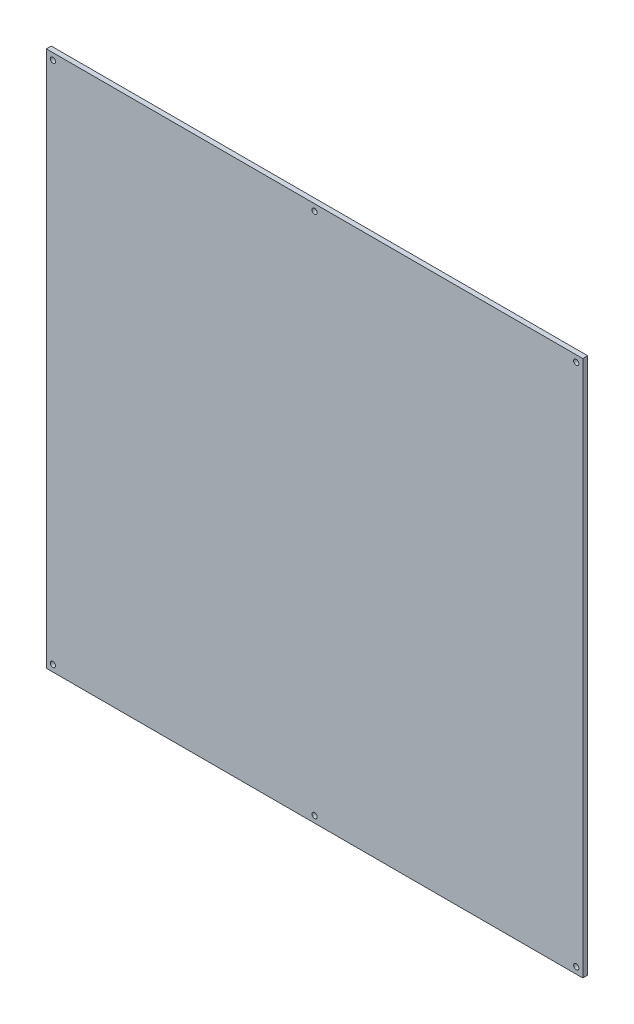
ISO-10303-21;
HEADER;
FILE_DESCRIPTION(('STEP AP214'),'2;1');
FILE_NAME('part.step','',(''),(''),'','','');
FILE_SCHEMA(('AUTOMOTIVE_DESIGN { 1 0 10303 214 1 1 1 1 }'));
ENDSEC;
DATA;
#1=APPLICATION_CONTEXT('core data for automotive mechanical design processes');
#2=APPLICATION_PROTOCOL_DEFINITION('international standard','automotive_design',2000,#1);
#3=PRODUCT_CONTEXT('',#1,'mechanical');
#4=PRODUCT('Part','Part','',(#3));
#5=PRODUCT_RELATED_PRODUCT_CATEGORY('part','',(#4));
#6=PRODUCT_DEFINITION_FORMATION('','',#4);
#7=PRODUCT_DEFINITION_CONTEXT('part definition',#1,'design');
#8=PRODUCT_DEFINITION('design','',#6,#7);
#9=PRODUCT_DEFINITION_SHAPE('','',#8);
#10=(LENGTH_UNIT() NAMED_UNIT(*) SI_UNIT(.MILLI.,.METRE.));
#11=(NAMED_UNIT(*) PLANE_ANGLE_UNIT() SI_UNIT($,.RADIAN.));
#12=(NAMED_UNIT(*) SI_UNIT($,.STERADIAN.) SOLID_ANGLE_UNIT());
#13=UNCERTAINTY_MEASURE_WITH_UNIT(LENGTH_MEASURE(1.E-05),#10,'distance_accuracy_value','');
#14=(GEOMETRIC_REPRESENTATION_CONTEXT(3) GLOBAL_UNCERTAINTY_ASSIGNED_CONTEXT((#13)) GLOBAL_UNIT_ASSIGNED_CONTEXT((#10,
#11,#12)) REPRESENTATION_CONTEXT('',''));
#15=CARTESIAN_POINT('',(0.,0.,0.));
#16=DIRECTION('',(0.,0.,1.));
#17=DIRECTION('',(1.,0.,0.));
#18=AXIS2_PLACEMENT_3D('',#15,#16,#17);
#19=CARTESIAN_POINT('',(0.,0.,3.));
#20=DIRECTION('',(1.,0.,0.));
#21=DIRECTION('',(0.,0.,-1.));
#22=AXIS2_PLACEMENT_3D('',#19,#20,#21);
#23=PLANE('',#22);
#24=DIRECTION('',(0.,-1.,0.));
#25=VECTOR('',#24,1.);
#26=CARTESIAN_POINT('',(0.,0.,0.));
#27=LINE('',#26,#25);
#28=CARTESIAN_POINT('',(0.,328.,0.));
#29=VERTEX_POINT('',#28);
#30=CARTESIAN_POINT('',(0.,0.,0.));
#31=VERTEX_POINT('',#30);
#32=EDGE_CURVE('E105',#29,#31,#27,.T.);
#33=ORIENTED_EDGE('',*,*,#32,.T.);
#34=DIRECTION('',(0.,0.,-1.));
#35=VECTOR('',#34,1.);
#36=CARTESIAN_POINT('',(0.,0.,3.));
#37=LINE('',#36,#35);
#38=CARTESIAN_POINT('',(0.,0.,3.));
#39=VERTEX_POINT('',#38);
#40=EDGE_CURVE('E11',#39,#31,#37,.T.);
#41=ORIENTED_EDGE('',*,*,#40,.F.);
#42=DIRECTION('',(0.,-1.,0.));
#43=VECTOR('',#42,1.);
#44=CARTESIAN_POINT('',(0.,0.,3.));
#45=LINE('',#44,#43);
#46=CARTESIAN_POINT('',(0.,328.,3.));
#47=VERTEX_POINT('',#46);
#48=EDGE_CURVE('E88',#47,#39,#45,.T.);
#49=ORIENTED_EDGE('',*,*,#48,.F.);
#50=DIRECTION('',(0.,0.,-1.));
#51=VECTOR('',#50,1.);
#52=CARTESIAN_POINT('',(0.,328.,3.));
#53=LINE('',#52,#51);
#54=EDGE_CURVE('E101',#47,#29,#53,.T.);
#55=ORIENTED_EDGE('',*,*,#54,.T.);
#56=EDGE_LOOP('',(#33,#41,#49,#55));
#57=FACE_BOUND('',#56,.T.);
#58=ADVANCED_FACE('F36',(#57),#23,.F.);
#59=CARTESIAN_POINT('',(0.,0.,3.));
#60=DIRECTION('',(0.,1.,0.));
#61=DIRECTION('',(0.,0.,1.));
#62=AXIS2_PLACEMENT_3D('',#59,#60,#61);
#63=PLANE('',#62);
#64=DIRECTION('',(1.,0.,0.));
#65=VECTOR('',#64,1.);
#66=CARTESIAN_POINT('',(0.,0.,0.));
#67=LINE('',#66,#65);
#68=CARTESIAN_POINT('',(328.,0.,0.));
#69=VERTEX_POINT('',#68);
#70=EDGE_CURVE('E93',#31,#69,#67,.T.);
#71=ORIENTED_EDGE('',*,*,#70,.T.);
#72=DIRECTION('',(0.,0.,-1.));
#73=VECTOR('',#72,1.);
#74=CARTESIAN_POINT('',(328.,0.,3.));
#75=LINE('',#74,#73);
#76=CARTESIAN_POINT('',(328.,0.,3.));
#77=VERTEX_POINT('',#76);
#78=EDGE_CURVE('E44',#77,#69,#75,.T.);
#79=ORIENTED_EDGE('',*,*,#78,.F.);
#80=DIRECTION('',(1.,0.,0.));
#81=VECTOR('',#80,1.);
#82=CARTESIAN_POINT('',(0.,0.,3.));
#83=LINE('',#82,#81);
#84=EDGE_CURVE('E82',#39,#77,#83,.T.);
#85=ORIENTED_EDGE('',*,*,#84,.F.);
#86=ORIENTED_EDGE('',*,*,#40,.T.);
#87=EDGE_LOOP('',(#71,#79,#85,#86));
#88=FACE_BOUND('',#87,.T.);
#89=ADVANCED_FACE('F92',(#88),#63,.F.);
#90=CARTESIAN_POINT('',(328.,0.,3.));
#91=DIRECTION('',(-1.,0.,0.));
#92=DIRECTION('',(0.,0.,1.));
#93=AXIS2_PLACEMENT_3D('',#90,#91,#92);
#94=PLANE('',#93);
#95=DIRECTION('',(0.,1.,0.));
#96=VECTOR('',#95,1.);
#97=CARTESIAN_POINT('',(328.,0.,0.));
#98=LINE('',#97,#96);
#99=CARTESIAN_POINT('',(328.,328.,0.));
#100=VERTEX_POINT('',#99);
#101=EDGE_CURVE('E69',#69,#100,#98,.T.);
#102=ORIENTED_EDGE('',*,*,#101,.T.);
#103=DIRECTION('',(0.,0.,-1.));
#104=VECTOR('',#103,1.);
#105=CARTESIAN_POINT('',(328.,328.,3.));
#106=LINE('',#105,#104);
#107=CARTESIAN_POINT('',(328.,328.,3.));
#108=VERTEX_POINT('',#107);
#109=EDGE_CURVE('E95',#108,#100,#106,.T.);
#110=ORIENTED_EDGE('',*,*,#109,.F.);
#111=DIRECTION('',(0.,1.,0.));
#112=VECTOR('',#111,1.);
#113=CARTESIAN_POINT('',(328.,0.,3.));
#114=LINE('',#113,#112);
#115=EDGE_CURVE('E86',#77,#108,#114,.T.);
#116=ORIENTED_EDGE('',*,*,#115,.F.);
#117=ORIENTED_EDGE('',*,*,#78,.T.);
#118=EDGE_LOOP('',(#102,#110,#116,#117));
#119=FACE_BOUND('',#118,.T.);
#120=ADVANCED_FACE('F96',(#119),#94,.F.);
#121=CARTESIAN_POINT('',(0.,328.,3.));
#122=DIRECTION('',(0.,-1.,0.));
#123=DIRECTION('',(0.,0.,-1.));
#124=AXIS2_PLACEMENT_3D('',#121,#122,#123);
#125=PLANE('',#124);
#126=DIRECTION('',(-1.,0.,0.));
#127=VECTOR('',#126,1.);
#128=CARTESIAN_POINT('',(0.,328.,0.));
#129=LINE('',#128,#127);
#130=EDGE_CURVE('E75',#100,#29,#129,.T.);
#131=ORIENTED_EDGE('',*,*,#130,.T.);
#132=ORIENTED_EDGE('',*,*,#54,.F.);
#133=DIRECTION('',(-1.,0.,0.));
#134=VECTOR('',#133,1.);
#135=CARTESIAN_POINT('',(0.,328.,3.));
#136=LINE('',#135,#134);
#137=EDGE_CURVE('E52',#108,#47,#136,.T.);
#138=ORIENTED_EDGE('',*,*,#137,.F.);
#139=ORIENTED_EDGE('',*,*,#109,.T.);
#140=EDGE_LOOP('',(#131,#132,#138,#139));
#141=FACE_BOUND('',#140,.T.);
#142=ADVANCED_FACE('F115',(#141),#125,.F.);
#143=CARTESIAN_POINT('',(0.,0.,3.));
#144=DIRECTION('',(0.,0.,-1.));
#145=DIRECTION('',(-1.,0.,0.));
#146=AXIS2_PLACEMENT_3D('',#143,#144,#145);
#147=PLANE('',#146);
#148=CARTESIAN_POINT('',(4.,4.,3.));
#149=DIRECTION('',(0.,0.,1.));
#150=DIRECTION('',(-1.,0.,0.));
#151=AXIS2_PLACEMENT_3D('',#148,#149,#150);
#152=CIRCLE('',#151,1.59999999999999);
#153=CARTESIAN_POINT('',(2.40000000000001,4.,3.));
#154=VERTEX_POINT('',#153);
#155=EDGE_CURVE('E131',#154,#154,#152,.T.);
#156=ORIENTED_EDGE('',*,*,#155,.F.);
#157=EDGE_LOOP('',(#156));
#158=FACE_BOUND('',#157,.T.);
#159=CARTESIAN_POINT('',(164.,4.,3.));
#160=DIRECTION('',(0.,0.,1.));
#161=DIRECTION('',(-1.,0.,0.));
#162=AXIS2_PLACEMENT_3D('',#159,#160,#161);
#163=CIRCLE('',#162,1.59999999999999);
#164=CARTESIAN_POINT('',(162.4,4.,3.));
#165=VERTEX_POINT('',#164);
#166=EDGE_CURVE('E130',#165,#165,#163,.T.);
#167=ORIENTED_EDGE('',*,*,#166,.F.);
#168=EDGE_LOOP('',(#167));
#169=FACE_BOUND('',#168,.T.);
#170=CARTESIAN_POINT('',(324.,4.,3.));
#171=DIRECTION('',(0.,0.,1.));
#172=DIRECTION('',(-1.,0.,0.));
#173=AXIS2_PLACEMENT_3D('',#170,#171,#172);
#174=CIRCLE('',#173,1.59999999999996);
#175=CARTESIAN_POINT('',(322.4,4.,3.));
#176=VERTEX_POINT('',#175);
#177=EDGE_CURVE('E137',#176,#176,#174,.T.);
#178=ORIENTED_EDGE('',*,*,#177,.F.);
#179=EDGE_LOOP('',(#178));
#180=FACE_BOUND('',#179,.T.);
#181=CARTESIAN_POINT('',(324.,324.,3.));
#182=DIRECTION('',(0.,0.,1.));
#183=DIRECTION('',(1.,0.,0.));
#184=AXIS2_PLACEMENT_3D('',#181,#182,#183);
#185=CIRCLE('',#184,1.59999999999996);
#186=CARTESIAN_POINT('',(325.6,324.,3.));
#187=VERTEX_POINT('',#186);
#188=EDGE_CURVE('E144',#187,#187,#185,.T.);
#189=ORIENTED_EDGE('',*,*,#188,.F.);
#190=EDGE_LOOP('',(#189));
#191=FACE_BOUND('',#190,.T.);
#192=CARTESIAN_POINT('',(164.,324.,3.));
#193=DIRECTION('',(0.,0.,1.));
#194=DIRECTION('',(1.,0.,0.));
#195=AXIS2_PLACEMENT_3D('',#192,#193,#194);
#196=CIRCLE('',#195,1.59999999999999);
#197=CARTESIAN_POINT('',(165.6,324.,3.));
#198=VERTEX_POINT('',#197);
#199=EDGE_CURVE('E151',#198,#198,#196,.T.);
#200=ORIENTED_EDGE('',*,*,#199,.F.);
#201=EDGE_LOOP('',(#200));
#202=FACE_BOUND('',#201,.T.);
#203=CARTESIAN_POINT('',(4.,324.,3.));
#204=DIRECTION('',(0.,0.,1.));
#205=DIRECTION('',(1.,0.,0.));
#206=AXIS2_PLACEMENT_3D('',#203,#204,#205);
#207=CIRCLE('',#206,1.59999999999999);
#208=CARTESIAN_POINT('',(5.59999999999999,324.,3.));
#209=VERTEX_POINT('',#208);
#210=EDGE_CURVE('E123',#209,#209,#207,.T.);
#211=ORIENTED_EDGE('',*,*,#210,.F.);
#212=EDGE_LOOP('',(#211));
#213=FACE_BOUND('',#212,.T.);
#214=ORIENTED_EDGE('',*,*,#48,.T.);
#215=ORIENTED_EDGE('',*,*,#84,.T.);
#216=ORIENTED_EDGE('',*,*,#115,.T.);
#217=ORIENTED_EDGE('',*,*,#137,.T.);
#218=EDGE_LOOP('',(#214,#215,#216,#217));
#219=FACE_BOUND('',#218,.T.);
#220=ADVANCED_FACE('F84',(#158,#169,#180,#191,#202,#213,#219),#147,.F.);
#221=CARTESIAN_POINT('',(0.,0.,0.));
#222=DIRECTION('',(0.,0.,-1.));
#223=DIRECTION('',(-1.,0.,0.));
#224=AXIS2_PLACEMENT_3D('',#221,#222,#223);
#225=PLANE('',#224);
#226=CARTESIAN_POINT('',(4.,4.,0.));
#227=DIRECTION('',(0.,0.,-1.));
#228=DIRECTION('',(-1.,0.,0.));
#229=AXIS2_PLACEMENT_3D('',#226,#227,#228);
#230=CIRCLE('',#229,1.59999999999999);
#231=CARTESIAN_POINT('',(2.40000000000001,4.,0.));
#232=VERTEX_POINT('',#231);
#233=EDGE_CURVE('E127',#232,#232,#230,.F.);
#234=ORIENTED_EDGE('',*,*,#233,.T.);
#235=EDGE_LOOP('',(#234));
#236=FACE_BOUND('',#235,.T.);
#237=CARTESIAN_POINT('',(164.,4.,0.));
#238=DIRECTION('',(0.,0.,-1.));
#239=DIRECTION('',(-1.,0.,0.));
#240=AXIS2_PLACEMENT_3D('',#237,#238,#239);
#241=CIRCLE('',#240,1.59999999999999);
#242=CARTESIAN_POINT('',(162.4,4.,0.));
#243=VERTEX_POINT('',#242);
#244=EDGE_CURVE('E134',#243,#243,#241,.F.);
#245=ORIENTED_EDGE('',*,*,#244,.T.);
#246=EDGE_LOOP('',(#245));
#247=FACE_BOUND('',#246,.T.);
#248=CARTESIAN_POINT('',(324.,4.,0.));
#249=DIRECTION('',(0.,0.,-1.));
#250=DIRECTION('',(-1.,0.,0.));
#251=AXIS2_PLACEMENT_3D('',#248,#249,#250);
#252=CIRCLE('',#251,1.59999999999996);
#253=CARTESIAN_POINT('',(322.4,4.,0.));
#254=VERTEX_POINT('',#253);
#255=EDGE_CURVE('E140',#254,#254,#252,.F.);
#256=ORIENTED_EDGE('',*,*,#255,.T.);
#257=EDGE_LOOP('',(#256));
#258=FACE_BOUND('',#257,.T.);
#259=CARTESIAN_POINT('',(324.,324.,0.));
#260=DIRECTION('',(0.,0.,-1.));
#261=DIRECTION('',(-1.,0.,0.));
#262=AXIS2_PLACEMENT_3D('',#259,#260,#261);
#263=CIRCLE('',#262,1.59999999999996);
#264=CARTESIAN_POINT('',(322.4,324.,0.));
#265=VERTEX_POINT('',#264);
#266=EDGE_CURVE('E148',#265,#265,#263,.F.);
#267=ORIENTED_EDGE('',*,*,#266,.T.);
#268=EDGE_LOOP('',(#267));
#269=FACE_BOUND('',#268,.T.);
#270=CARTESIAN_POINT('',(164.,324.,0.));
#271=DIRECTION('',(0.,0.,-1.));
#272=DIRECTION('',(-1.,0.,0.));
#273=AXIS2_PLACEMENT_3D('',#270,#271,#272);
#274=CIRCLE('',#273,1.59999999999999);
#275=CARTESIAN_POINT('',(162.4,324.,0.));
#276=VERTEX_POINT('',#275);
#277=EDGE_CURVE('E126',#276,#276,#274,.F.);
#278=ORIENTED_EDGE('',*,*,#277,.T.);
#279=EDGE_LOOP('',(#278));
#280=FACE_BOUND('',#279,.T.);
#281=CARTESIAN_POINT('',(4.,324.,0.));
#282=DIRECTION('',(0.,0.,-1.));
#283=DIRECTION('',(-1.,0.,0.));
#284=AXIS2_PLACEMENT_3D('',#281,#282,#283);
#285=CIRCLE('',#284,1.59999999999999);
#286=CARTESIAN_POINT('',(2.40000000000002,324.,0.));
#287=VERTEX_POINT('',#286);
#288=EDGE_CURVE('E108',#287,#287,#285,.F.);
#289=ORIENTED_EDGE('',*,*,#288,.T.);
#290=EDGE_LOOP('',(#289));
#291=FACE_BOUND('',#290,.T.);
#292=ORIENTED_EDGE('',*,*,#32,.F.);
#293=ORIENTED_EDGE('',*,*,#130,.F.);
#294=ORIENTED_EDGE('',*,*,#101,.F.);
#295=ORIENTED_EDGE('',*,*,#70,.F.);
#296=EDGE_LOOP('',(#292,#293,#294,#295));
#297=FACE_BOUND('',#296,.T.);
#298=ADVANCED_FACE('F118',(#236,#247,#258,#269,#280,#291,#297),#225,.T.);
#299=CARTESIAN_POINT('',(4.,324.,-4.52548339959388));
#300=DIRECTION('',(0.,0.,1.));
#301=DIRECTION('',(1.,0.,0.));
#302=AXIS2_PLACEMENT_3D('',#299,#300,#301);
#303=CYLINDRICAL_SURFACE('',#302,1.59999999999999);
#304=ORIENTED_EDGE('',*,*,#210,.T.);
#305=EDGE_LOOP('',(#304));
#306=FACE_BOUND('',#305,.T.);
#307=ORIENTED_EDGE('',*,*,#288,.F.);
#308=EDGE_LOOP('',(#307));
#309=FACE_BOUND('',#308,.T.);
#310=ADVANCED_FACE('F170',(#306,#309),#303,.F.);
#311=CARTESIAN_POINT('',(164.,324.,-4.52548339959388));
#312=DIRECTION('',(0.,0.,1.));
#313=DIRECTION('',(1.,0.,0.));
#314=AXIS2_PLACEMENT_3D('',#311,#312,#313);
#315=CYLINDRICAL_SURFACE('',#314,1.59999999999999);
#316=ORIENTED_EDGE('',*,*,#199,.T.);
#317=EDGE_LOOP('',(#316));
#318=FACE_BOUND('',#317,.T.);
#319=ORIENTED_EDGE('',*,*,#277,.F.);
#320=EDGE_LOOP('',(#319));
#321=FACE_BOUND('',#320,.T.);
#322=ADVANCED_FACE('F161',(#318,#321),#315,.F.);
#323=CARTESIAN_POINT('',(324.,324.,-4.52548339959388));
#324=DIRECTION('',(0.,0.,1.));
#325=DIRECTION('',(1.,0.,0.));
#326=AXIS2_PLACEMENT_3D('',#323,#324,#325);
#327=CYLINDRICAL_SURFACE('',#326,1.59999999999996);
#328=ORIENTED_EDGE('',*,*,#188,.T.);
#329=EDGE_LOOP('',(#328));
#330=FACE_BOUND('',#329,.T.);
#331=ORIENTED_EDGE('',*,*,#266,.F.);
#332=EDGE_LOOP('',(#331));
#333=FACE_BOUND('',#332,.T.);
#334=ADVANCED_FACE('F219',(#330,#333),#327,.F.);
#335=CARTESIAN_POINT('',(324.,4.,-4.52548339959388));
#336=DIRECTION('',(0.,0.,1.));
#337=DIRECTION('',(1.,0.,0.));
#338=AXIS2_PLACEMENT_3D('',#335,#336,#337);
#339=CYLINDRICAL_SURFACE('',#338,1.59999999999996);
#340=ORIENTED_EDGE('',*,*,#177,.T.);
#341=EDGE_LOOP('',(#340));
#342=FACE_BOUND('',#341,.T.);
#343=ORIENTED_EDGE('',*,*,#255,.F.);
#344=EDGE_LOOP('',(#343));
#345=FACE_BOUND('',#344,.T.);
#346=ADVANCED_FACE('F228',(#342,#345),#339,.F.);
#347=CARTESIAN_POINT('',(164.,4.,-4.52548339959388));
#348=DIRECTION('',(0.,0.,1.));
#349=DIRECTION('',(1.,0.,0.));
#350=AXIS2_PLACEMENT_3D('',#347,#348,#349);
#351=CYLINDRICAL_SURFACE('',#350,1.59999999999999);
#352=ORIENTED_EDGE('',*,*,#166,.T.);
#353=EDGE_LOOP('',(#352));
#354=FACE_BOUND('',#353,.T.);
#355=ORIENTED_EDGE('',*,*,#244,.F.);
#356=EDGE_LOOP('',(#355));
#357=FACE_BOUND('',#356,.T.);
#358=ADVANCED_FACE('F238',(#354,#357),#351,.F.);
#359=CARTESIAN_POINT('',(4.,4.,-4.52548339959388));
#360=DIRECTION('',(0.,0.,1.));
#361=DIRECTION('',(1.,0.,0.));
#362=AXIS2_PLACEMENT_3D('',#359,#360,#361);
#363=CYLINDRICAL_SURFACE('',#362,1.59999999999999);
#364=ORIENTED_EDGE('',*,*,#155,.T.);
#365=EDGE_LOOP('',(#364));
#366=FACE_BOUND('',#365,.T.);
#367=ORIENTED_EDGE('',*,*,#233,.F.);
#368=EDGE_LOOP('',(#367));
#369=FACE_BOUND('',#368,.T.);
#370=ADVANCED_FACE('F248',(#366,#369),#363,.F.);
#371=CLOSED_SHELL('',(#58,#89,#120,#142,#220,#298,#310,#322,#334,#346,#358,#370));
#372=MANIFOLD_SOLID_BREP('B2',#371);
#373=ADVANCED_BREP_SHAPE_REPRESENTATION('',(#18,#372),#14);
#374=SHAPE_DEFINITION_REPRESENTATION(#9,#373);
ENDSEC;
END-ISO-10303-21;
